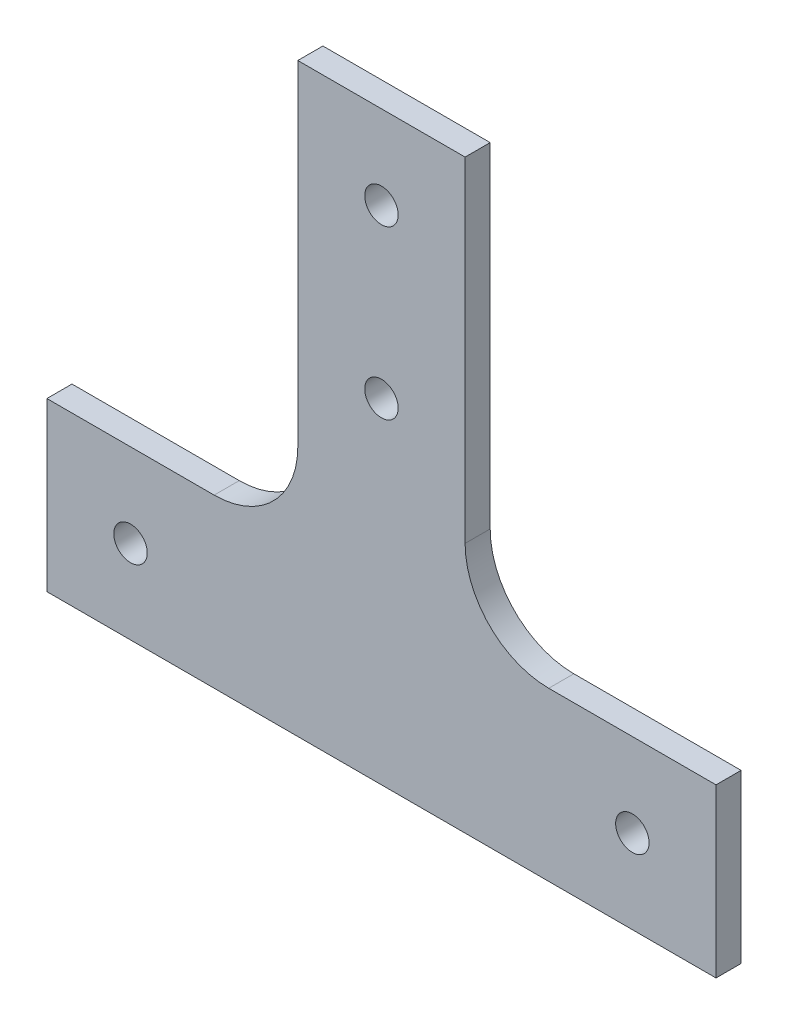
ISO-10303-21;
HEADER;
FILE_DESCRIPTION(('STEP AP214'),'2;1');
FILE_NAME('part.step','',(''),(''),'','','');
FILE_SCHEMA(('AUTOMOTIVE_DESIGN { 1 0 10303 214 1 1 1 1 }'));
ENDSEC;
DATA;
#1=APPLICATION_CONTEXT('core data for automotive mechanical design processes');
#2=APPLICATION_PROTOCOL_DEFINITION('international standard','automotive_design',2000,#1);
#3=PRODUCT_CONTEXT('',#1,'mechanical');
#4=PRODUCT('Part','Part','',(#3));
#5=PRODUCT_RELATED_PRODUCT_CATEGORY('part','',(#4));
#6=PRODUCT_DEFINITION_FORMATION('','',#4);
#7=PRODUCT_DEFINITION_CONTEXT('part definition',#1,'design');
#8=PRODUCT_DEFINITION('design','',#6,#7);
#9=PRODUCT_DEFINITION_SHAPE('','',#8);
#10=(LENGTH_UNIT() NAMED_UNIT(*) SI_UNIT(.MILLI.,.METRE.));
#11=(NAMED_UNIT(*) PLANE_ANGLE_UNIT() SI_UNIT($,.RADIAN.));
#12=(NAMED_UNIT(*) SI_UNIT($,.STERADIAN.) SOLID_ANGLE_UNIT());
#13=UNCERTAINTY_MEASURE_WITH_UNIT(LENGTH_MEASURE(1.E-05),#10,'distance_accuracy_value','');
#14=(GEOMETRIC_REPRESENTATION_CONTEXT(3) GLOBAL_UNCERTAINTY_ASSIGNED_CONTEXT((#13)) GLOBAL_UNIT_ASSIGNED_CONTEXT((#10,
#11,#12)) REPRESENTATION_CONTEXT('',''));
#15=CARTESIAN_POINT('',(0.,0.,0.));
#16=DIRECTION('',(0.,0.,1.));
#17=DIRECTION('',(1.,0.,0.));
#18=AXIS2_PLACEMENT_3D('',#15,#16,#17);
#19=CARTESIAN_POINT('',(-10.,0.,3.));
#20=DIRECTION('',(-1.,0.,0.));
#21=DIRECTION('',(0.,0.,1.));
#22=AXIS2_PLACEMENT_3D('',#19,#20,#21);
#23=PLANE('',#22);
#24=DIRECTION('',(0.,1.,0.));
#25=VECTOR('',#24,1.);
#26=CARTESIAN_POINT('',(-10.,0.,0.));
#27=LINE('',#26,#25);
#28=CARTESIAN_POINT('',(-10.,20.,0.));
#29=VERTEX_POINT('',#28);
#30=CARTESIAN_POINT('',(-10.,60.,0.));
#31=VERTEX_POINT('',#30);
#32=EDGE_CURVE('E196',#29,#31,#27,.T.);
#33=ORIENTED_EDGE('',*,*,#32,.F.);
#34=DIRECTION('',(0.,0.,-1.));
#35=VECTOR('',#34,1.);
#36=CARTESIAN_POINT('',(-10.,20.,3.));
#37=LINE('',#36,#35);
#38=CARTESIAN_POINT('',(-10.,20.,3.));
#39=VERTEX_POINT('',#38);
#40=EDGE_CURVE('E246',#29,#39,#37,.F.);
#41=ORIENTED_EDGE('',*,*,#40,.T.);
#42=DIRECTION('',(0.,1.,0.));
#43=VECTOR('',#42,1.);
#44=CARTESIAN_POINT('',(-10.,0.,3.));
#45=LINE('',#44,#43);
#46=CARTESIAN_POINT('',(-10.,60.,3.));
#47=VERTEX_POINT('',#46);
#48=EDGE_CURVE('E154',#39,#47,#45,.T.);
#49=ORIENTED_EDGE('',*,*,#48,.T.);
#50=DIRECTION('',(0.,0.,-1.));
#51=VECTOR('',#50,1.);
#52=CARTESIAN_POINT('',(-10.,60.,3.));
#53=LINE('',#52,#51);
#54=EDGE_CURVE('E187',#47,#31,#53,.T.);
#55=ORIENTED_EDGE('',*,*,#54,.T.);
#56=EDGE_LOOP('',(#33,#41,#49,#55));
#57=FACE_BOUND('',#56,.T.);
#58=ADVANCED_FACE('F47',(#57),#23,.T.);
#59=CARTESIAN_POINT('',(0.,10.,3.));
#60=DIRECTION('',(0.,1.,0.));
#61=DIRECTION('',(-1.,0.,0.));
#62=AXIS2_PLACEMENT_3D('',#59,#60,#61);
#63=PLANE('',#62);
#64=DIRECTION('',(1.,0.,0.));
#65=VECTOR('',#64,1.);
#66=CARTESIAN_POINT('',(0.,10.,3.));
#67=LINE('',#66,#65);
#68=CARTESIAN_POINT('',(-40.,9.99999999999999,3.));
#69=VERTEX_POINT('',#68);
#70=CARTESIAN_POINT('',(-20.,10.,3.));
#71=VERTEX_POINT('',#70);
#72=EDGE_CURVE('E128',#69,#71,#67,.T.);
#73=ORIENTED_EDGE('',*,*,#72,.T.);
#74=DIRECTION('',(0.,0.,-1.));
#75=VECTOR('',#74,1.);
#76=CARTESIAN_POINT('',(-20.,10.,0.));
#77=LINE('',#76,#75);
#78=CARTESIAN_POINT('',(-20.,10.,0.));
#79=VERTEX_POINT('',#78);
#80=EDGE_CURVE('E136',#71,#79,#77,.T.);
#81=ORIENTED_EDGE('',*,*,#80,.T.);
#82=DIRECTION('',(1.,0.,0.));
#83=VECTOR('',#82,1.);
#84=CARTESIAN_POINT('',(0.,10.,0.));
#85=LINE('',#84,#83);
#86=CARTESIAN_POINT('',(-40.,9.99999999999999,0.));
#87=VERTEX_POINT('',#86);
#88=EDGE_CURVE('E131',#87,#79,#85,.T.);
#89=ORIENTED_EDGE('',*,*,#88,.F.);
#90=DIRECTION('',(0.,0.,-1.));
#91=VECTOR('',#90,1.);
#92=CARTESIAN_POINT('',(-40.,9.99999999999999,3.));
#93=LINE('',#92,#91);
#94=EDGE_CURVE('E123',#69,#87,#93,.T.);
#95=ORIENTED_EDGE('',*,*,#94,.F.);
#96=EDGE_LOOP('',(#73,#81,#89,#95));
#97=FACE_BOUND('',#96,.T.);
#98=ADVANCED_FACE('F125',(#97),#63,.T.);
#99=CARTESIAN_POINT('',(-40.,0.,3.));
#100=DIRECTION('',(1.,0.,0.));
#101=DIRECTION('',(0.,1.,0.));
#102=AXIS2_PLACEMENT_3D('',#99,#100,#101);
#103=PLANE('',#102);
#104=DIRECTION('',(0.,-1.,0.));
#105=VECTOR('',#104,1.);
#106=CARTESIAN_POINT('',(-40.,0.,0.));
#107=LINE('',#106,#105);
#108=CARTESIAN_POINT('',(-40.,-10.,0.));
#109=VERTEX_POINT('',#108);
#110=EDGE_CURVE('E201',#87,#109,#107,.T.);
#111=ORIENTED_EDGE('',*,*,#110,.T.);
#112=DIRECTION('',(0.,0.,-1.));
#113=VECTOR('',#112,1.);
#114=CARTESIAN_POINT('',(-40.,-10.,3.));
#115=LINE('',#114,#113);
#116=CARTESIAN_POINT('',(-40.,-10.,3.));
#117=VERTEX_POINT('',#116);
#118=EDGE_CURVE('E137',#117,#109,#115,.T.);
#119=ORIENTED_EDGE('',*,*,#118,.F.);
#120=DIRECTION('',(0.,-1.,0.));
#121=VECTOR('',#120,1.);
#122=CARTESIAN_POINT('',(-40.,0.,3.));
#123=LINE('',#122,#121);
#124=EDGE_CURVE('E141',#69,#117,#123,.T.);
#125=ORIENTED_EDGE('',*,*,#124,.F.);
#126=ORIENTED_EDGE('',*,*,#94,.T.);
#127=EDGE_LOOP('',(#111,#119,#125,#126));
#128=FACE_BOUND('',#127,.T.);
#129=ADVANCED_FACE('F142',(#128),#103,.F.);
#130=CARTESIAN_POINT('',(0.,-10.,3.));
#131=DIRECTION('',(0.,1.,0.));
#132=DIRECTION('',(-1.,0.,0.));
#133=AXIS2_PLACEMENT_3D('',#130,#131,#132);
#134=PLANE('',#133);
#135=DIRECTION('',(1.,0.,0.));
#136=VECTOR('',#135,1.);
#137=CARTESIAN_POINT('',(0.,-10.,0.));
#138=LINE('',#137,#136);
#139=CARTESIAN_POINT('',(40.,-10.,0.));
#140=VERTEX_POINT('',#139);
#141=EDGE_CURVE('E205',#109,#140,#138,.T.);
#142=ORIENTED_EDGE('',*,*,#141,.T.);
#143=DIRECTION('',(0.,0.,-1.));
#144=VECTOR('',#143,1.);
#145=CARTESIAN_POINT('',(40.,-10.,3.));
#146=LINE('',#145,#144);
#147=CARTESIAN_POINT('',(40.,-10.,3.));
#148=VERTEX_POINT('',#147);
#149=EDGE_CURVE('E239',#148,#140,#146,.T.);
#150=ORIENTED_EDGE('',*,*,#149,.F.);
#151=DIRECTION('',(1.,0.,0.));
#152=VECTOR('',#151,1.);
#153=CARTESIAN_POINT('',(0.,-10.,3.));
#154=LINE('',#153,#152);
#155=EDGE_CURVE('E146',#117,#148,#154,.T.);
#156=ORIENTED_EDGE('',*,*,#155,.F.);
#157=ORIENTED_EDGE('',*,*,#118,.T.);
#158=EDGE_LOOP('',(#142,#150,#156,#157));
#159=FACE_BOUND('',#158,.T.);
#160=ADVANCED_FACE('F335',(#159),#134,.F.);
#161=CARTESIAN_POINT('',(40.,0.,3.));
#162=DIRECTION('',(1.,0.,0.));
#163=DIRECTION('',(0.,1.,0.));
#164=AXIS2_PLACEMENT_3D('',#161,#162,#163);
#165=PLANE('',#164);
#166=DIRECTION('',(0.,-1.,0.));
#167=VECTOR('',#166,1.);
#168=CARTESIAN_POINT('',(40.,0.,0.));
#169=LINE('',#168,#167);
#170=CARTESIAN_POINT('',(40.,10.,0.));
#171=VERTEX_POINT('',#170);
#172=EDGE_CURVE('E209',#171,#140,#169,.T.);
#173=ORIENTED_EDGE('',*,*,#172,.F.);
#174=DIRECTION('',(0.,0.,-1.));
#175=VECTOR('',#174,1.);
#176=CARTESIAN_POINT('',(40.,10.,3.));
#177=LINE('',#176,#175);
#178=CARTESIAN_POINT('',(40.,10.,3.));
#179=VERTEX_POINT('',#178);
#180=EDGE_CURVE('E236',#179,#171,#177,.T.);
#181=ORIENTED_EDGE('',*,*,#180,.F.);
#182=DIRECTION('',(0.,-1.,0.));
#183=VECTOR('',#182,1.);
#184=CARTESIAN_POINT('',(40.,0.,3.));
#185=LINE('',#184,#183);
#186=EDGE_CURVE('E162',#179,#148,#185,.T.);
#187=ORIENTED_EDGE('',*,*,#186,.T.);
#188=ORIENTED_EDGE('',*,*,#149,.T.);
#189=EDGE_LOOP('',(#173,#181,#187,#188));
#190=FACE_BOUND('',#189,.T.);
#191=ADVANCED_FACE('F333',(#190),#165,.T.);
#192=CARTESIAN_POINT('',(20.,10.,0.));
#193=VERTEX_POINT('',#192);
#194=EDGE_CURVE('E202',#193,#171,#85,.T.);
#195=ORIENTED_EDGE('',*,*,#194,.F.);
#196=DIRECTION('',(0.,0.,-1.));
#197=VECTOR('',#196,1.);
#198=CARTESIAN_POINT('',(20.,10.,3.));
#199=LINE('',#198,#197);
#200=CARTESIAN_POINT('',(20.,10.,3.));
#201=VERTEX_POINT('',#200);
#202=EDGE_CURVE('E63',#193,#201,#199,.F.);
#203=ORIENTED_EDGE('',*,*,#202,.T.);
#204=EDGE_CURVE('E156',#201,#179,#67,.T.);
#205=ORIENTED_EDGE('',*,*,#204,.T.);
#206=ORIENTED_EDGE('',*,*,#180,.T.);
#207=EDGE_LOOP('',(#195,#203,#205,#206));
#208=FACE_BOUND('',#207,.T.);
#209=ADVANCED_FACE('F285',(#208),#63,.T.);
#210=CARTESIAN_POINT('',(10.,0.,3.));
#211=DIRECTION('',(-1.,0.,0.));
#212=DIRECTION('',(0.,0.,1.));
#213=AXIS2_PLACEMENT_3D('',#210,#211,#212);
#214=PLANE('',#213);
#215=DIRECTION('',(0.,1.,0.));
#216=VECTOR('',#215,1.);
#217=CARTESIAN_POINT('',(10.,0.,3.));
#218=LINE('',#217,#216);
#219=CARTESIAN_POINT('',(10.,20.,3.));
#220=VERTEX_POINT('',#219);
#221=CARTESIAN_POINT('',(10.,60.,3.));
#222=VERTEX_POINT('',#221);
#223=EDGE_CURVE('E161',#220,#222,#218,.T.);
#224=ORIENTED_EDGE('',*,*,#223,.F.);
#225=DIRECTION('',(0.,0.,-1.));
#226=VECTOR('',#225,1.);
#227=CARTESIAN_POINT('',(10.,20.,3.));
#228=LINE('',#227,#226);
#229=CARTESIAN_POINT('',(10.,20.,0.));
#230=VERTEX_POINT('',#229);
#231=EDGE_CURVE('E249',#220,#230,#228,.T.);
#232=ORIENTED_EDGE('',*,*,#231,.T.);
#233=DIRECTION('',(0.,1.,0.));
#234=VECTOR('',#233,1.);
#235=CARTESIAN_POINT('',(10.,0.,0.));
#236=LINE('',#235,#234);
#237=CARTESIAN_POINT('',(10.,60.,0.));
#238=VERTEX_POINT('',#237);
#239=EDGE_CURVE('E213',#230,#238,#236,.T.);
#240=ORIENTED_EDGE('',*,*,#239,.T.);
#241=DIRECTION('',(0.,0.,-1.));
#242=VECTOR('',#241,1.);
#243=CARTESIAN_POINT('',(10.,60.,3.));
#244=LINE('',#243,#242);
#245=EDGE_CURVE('E232',#222,#238,#244,.T.);
#246=ORIENTED_EDGE('',*,*,#245,.F.);
#247=EDGE_LOOP('',(#224,#232,#240,#246));
#248=FACE_BOUND('',#247,.T.);
#249=ADVANCED_FACE('F325',(#248),#214,.F.);
#250=CARTESIAN_POINT('',(30.,0.,3.));
#251=DIRECTION('',(0.,0.,-1.));
#252=DIRECTION('',(-1.,0.,0.));
#253=AXIS2_PLACEMENT_3D('',#250,#251,#252);
#254=CYLINDRICAL_SURFACE('',#253,2.);
#255=CARTESIAN_POINT('',(30.,0.,3.));
#256=DIRECTION('',(0.,0.,1.));
#257=DIRECTION('',(1.,0.,0.));
#258=AXIS2_PLACEMENT_3D('',#255,#256,#257);
#259=CIRCLE('',#258,2.);
#260=CARTESIAN_POINT('',(32.,0.,3.));
#261=VERTEX_POINT('',#260);
#262=EDGE_CURVE('E179',#261,#261,#259,.T.);
#263=ORIENTED_EDGE('',*,*,#262,.T.);
#264=EDGE_LOOP('',(#263));
#265=FACE_BOUND('',#264,.T.);
#266=CARTESIAN_POINT('',(30.,0.,0.));
#267=DIRECTION('',(0.,0.,1.));
#268=DIRECTION('',(1.,0.,0.));
#269=AXIS2_PLACEMENT_3D('',#266,#267,#268);
#270=CIRCLE('',#269,2.);
#271=CARTESIAN_POINT('',(32.,0.,0.));
#272=VERTEX_POINT('',#271);
#273=EDGE_CURVE('E220',#272,#272,#270,.T.);
#274=ORIENTED_EDGE('',*,*,#273,.F.);
#275=EDGE_LOOP('',(#274));
#276=FACE_BOUND('',#275,.T.);
#277=ADVANCED_FACE('F322',(#265,#276),#254,.F.);
#278=CARTESIAN_POINT('',(0.,60.,3.));
#279=DIRECTION('',(0.,1.,0.));
#280=DIRECTION('',(0.,0.,1.));
#281=AXIS2_PLACEMENT_3D('',#278,#279,#280);
#282=PLANE('',#281);
#283=DIRECTION('',(1.,0.,0.));
#284=VECTOR('',#283,1.);
#285=CARTESIAN_POINT('',(0.,60.,0.));
#286=LINE('',#285,#284);
#287=EDGE_CURVE('E216',#31,#238,#286,.T.);
#288=ORIENTED_EDGE('',*,*,#287,.F.);
#289=ORIENTED_EDGE('',*,*,#54,.F.);
#290=DIRECTION('',(1.,0.,0.));
#291=VECTOR('',#290,1.);
#292=CARTESIAN_POINT('',(0.,60.,3.));
#293=LINE('',#292,#291);
#294=EDGE_CURVE('E167',#47,#222,#293,.T.);
#295=ORIENTED_EDGE('',*,*,#294,.T.);
#296=ORIENTED_EDGE('',*,*,#245,.T.);
#297=EDGE_LOOP('',(#288,#289,#295,#296));
#298=FACE_BOUND('',#297,.T.);
#299=ADVANCED_FACE('F292',(#298),#282,.T.);
#300=CARTESIAN_POINT('',(0.,30.,3.));
#301=DIRECTION('',(0.,0.,-1.));
#302=DIRECTION('',(-1.,0.,0.));
#303=AXIS2_PLACEMENT_3D('',#300,#301,#302);
#304=CYLINDRICAL_SURFACE('',#303,2.);
#305=CARTESIAN_POINT('',(0.,30.,3.));
#306=DIRECTION('',(0.,0.,1.));
#307=DIRECTION('',(1.,0.,0.));
#308=AXIS2_PLACEMENT_3D('',#305,#306,#307);
#309=CIRCLE('',#308,2.);
#310=CARTESIAN_POINT('',(2.,30.,3.));
#311=VERTEX_POINT('',#310);
#312=EDGE_CURVE('E158',#311,#311,#309,.T.);
#313=ORIENTED_EDGE('',*,*,#312,.T.);
#314=EDGE_LOOP('',(#313));
#315=FACE_BOUND('',#314,.T.);
#316=CARTESIAN_POINT('',(0.,30.,0.));
#317=DIRECTION('',(0.,0.,1.));
#318=DIRECTION('',(1.,0.,0.));
#319=AXIS2_PLACEMENT_3D('',#316,#317,#318);
#320=CIRCLE('',#319,2.);
#321=CARTESIAN_POINT('',(2.,30.,0.));
#322=VERTEX_POINT('',#321);
#323=EDGE_CURVE('E192',#322,#322,#320,.T.);
#324=ORIENTED_EDGE('',*,*,#323,.F.);
#325=EDGE_LOOP('',(#324));
#326=FACE_BOUND('',#325,.T.);
#327=ADVANCED_FACE('F289',(#315,#326),#304,.F.);
#328=CARTESIAN_POINT('',(0.,50.,3.));
#329=DIRECTION('',(0.,0.,-1.));
#330=DIRECTION('',(-1.,0.,0.));
#331=AXIS2_PLACEMENT_3D('',#328,#329,#330);
#332=CYLINDRICAL_SURFACE('',#331,2.);
#333=CARTESIAN_POINT('',(0.,50.,3.));
#334=DIRECTION('',(0.,0.,1.));
#335=DIRECTION('',(1.,0.,0.));
#336=AXIS2_PLACEMENT_3D('',#333,#334,#335);
#337=CIRCLE('',#336,2.);
#338=CARTESIAN_POINT('',(2.,50.,3.));
#339=VERTEX_POINT('',#338);
#340=EDGE_CURVE('E228',#339,#339,#337,.T.);
#341=ORIENTED_EDGE('',*,*,#340,.T.);
#342=EDGE_LOOP('',(#341));
#343=FACE_BOUND('',#342,.T.);
#344=CARTESIAN_POINT('',(0.,50.,0.));
#345=DIRECTION('',(0.,0.,1.));
#346=DIRECTION('',(1.,0.,0.));
#347=AXIS2_PLACEMENT_3D('',#344,#345,#346);
#348=CIRCLE('',#347,2.);
#349=CARTESIAN_POINT('',(2.,50.,0.));
#350=VERTEX_POINT('',#349);
#351=EDGE_CURVE('E188',#350,#350,#348,.T.);
#352=ORIENTED_EDGE('',*,*,#351,.F.);
#353=EDGE_LOOP('',(#352));
#354=FACE_BOUND('',#353,.T.);
#355=ADVANCED_FACE('F291',(#343,#354),#332,.F.);
#356=CARTESIAN_POINT('',(-30.,0.,3.));
#357=DIRECTION('',(0.,0.,-1.));
#358=DIRECTION('',(-1.,0.,0.));
#359=AXIS2_PLACEMENT_3D('',#356,#357,#358);
#360=CYLINDRICAL_SURFACE('',#359,2.);
#361=CARTESIAN_POINT('',(-30.,0.,3.));
#362=DIRECTION('',(0.,0.,1.));
#363=DIRECTION('',(1.,0.,0.));
#364=AXIS2_PLACEMENT_3D('',#361,#362,#363);
#365=CIRCLE('',#364,2.);
#366=CARTESIAN_POINT('',(-28.,0.,3.));
#367=VERTEX_POINT('',#366);
#368=EDGE_CURVE('E183',#367,#367,#365,.T.);
#369=ORIENTED_EDGE('',*,*,#368,.T.);
#370=EDGE_LOOP('',(#369));
#371=FACE_BOUND('',#370,.T.);
#372=CARTESIAN_POINT('',(-30.,0.,0.));
#373=DIRECTION('',(0.,0.,1.));
#374=DIRECTION('',(1.,0.,0.));
#375=AXIS2_PLACEMENT_3D('',#372,#373,#374);
#376=CIRCLE('',#375,2.);
#377=CARTESIAN_POINT('',(-28.,0.,0.));
#378=VERTEX_POINT('',#377);
#379=EDGE_CURVE('E224',#378,#378,#376,.T.);
#380=ORIENTED_EDGE('',*,*,#379,.F.);
#381=EDGE_LOOP('',(#380));
#382=FACE_BOUND('',#381,.T.);
#383=ADVANCED_FACE('F295',(#371,#382),#360,.F.);
#384=CARTESIAN_POINT('',(0.,0.,3.));
#385=DIRECTION('',(0.,0.,1.));
#386=DIRECTION('',(1.,0.,0.));
#387=AXIS2_PLACEMENT_3D('',#384,#385,#386);
#388=PLANE('',#387);
#389=ORIENTED_EDGE('',*,*,#340,.F.);
#390=EDGE_LOOP('',(#389));
#391=FACE_BOUND('',#390,.T.);
#392=ORIENTED_EDGE('',*,*,#312,.F.);
#393=EDGE_LOOP('',(#392));
#394=FACE_BOUND('',#393,.T.);
#395=ORIENTED_EDGE('',*,*,#48,.F.);
#396=CARTESIAN_POINT('',(-20.,20.,3.));
#397=DIRECTION('',(0.,0.,1.));
#398=DIRECTION('',(1.,0.,0.));
#399=AXIS2_PLACEMENT_3D('',#396,#397,#398);
#400=CIRCLE('',#399,10.);
#401=EDGE_CURVE('E152',#39,#71,#400,.F.);
#402=ORIENTED_EDGE('',*,*,#401,.T.);
#403=ORIENTED_EDGE('',*,*,#72,.F.);
#404=ORIENTED_EDGE('',*,*,#124,.T.);
#405=ORIENTED_EDGE('',*,*,#155,.T.);
#406=ORIENTED_EDGE('',*,*,#186,.F.);
#407=ORIENTED_EDGE('',*,*,#204,.F.);
#408=CARTESIAN_POINT('',(20.,20.,3.));
#409=DIRECTION('',(0.,0.,1.));
#410=DIRECTION('',(1.,0.,0.));
#411=AXIS2_PLACEMENT_3D('',#408,#409,#410);
#412=CIRCLE('',#411,10.);
#413=EDGE_CURVE('E11',#201,#220,#412,.F.);
#414=ORIENTED_EDGE('',*,*,#413,.T.);
#415=ORIENTED_EDGE('',*,*,#223,.T.);
#416=ORIENTED_EDGE('',*,*,#294,.F.);
#417=EDGE_LOOP('',(#395,#402,#403,#404,#405,#406,#407,#414,#415,#416));
#418=FACE_BOUND('',#417,.T.);
#419=ORIENTED_EDGE('',*,*,#262,.F.);
#420=EDGE_LOOP('',(#419));
#421=FACE_BOUND('',#420,.T.);
#422=ORIENTED_EDGE('',*,*,#368,.F.);
#423=EDGE_LOOP('',(#422));
#424=FACE_BOUND('',#423,.T.);
#425=ADVANCED_FACE('F149',(#391,#394,#418,#421,#424),#388,.T.);
#426=CARTESIAN_POINT('',(0.,0.,0.));
#427=DIRECTION('',(0.,0.,1.));
#428=DIRECTION('',(1.,0.,0.));
#429=AXIS2_PLACEMENT_3D('',#426,#427,#428);
#430=PLANE('',#429);
#431=ORIENTED_EDGE('',*,*,#351,.T.);
#432=EDGE_LOOP('',(#431));
#433=FACE_BOUND('',#432,.T.);
#434=ORIENTED_EDGE('',*,*,#323,.T.);
#435=EDGE_LOOP('',(#434));
#436=FACE_BOUND('',#435,.T.);
#437=ORIENTED_EDGE('',*,*,#88,.T.);
#438=CARTESIAN_POINT('',(-20.,20.,0.));
#439=DIRECTION('',(0.,0.,1.));
#440=DIRECTION('',(1.,0.,0.));
#441=AXIS2_PLACEMENT_3D('',#438,#439,#440);
#442=CIRCLE('',#441,10.);
#443=EDGE_CURVE('E255',#79,#29,#442,.T.);
#444=ORIENTED_EDGE('',*,*,#443,.T.);
#445=ORIENTED_EDGE('',*,*,#32,.T.);
#446=ORIENTED_EDGE('',*,*,#287,.T.);
#447=ORIENTED_EDGE('',*,*,#239,.F.);
#448=CARTESIAN_POINT('',(20.,20.,0.));
#449=DIRECTION('',(0.,0.,1.));
#450=DIRECTION('',(1.,0.,0.));
#451=AXIS2_PLACEMENT_3D('',#448,#449,#450);
#452=CIRCLE('',#451,10.);
#453=EDGE_CURVE('E56',#230,#193,#452,.T.);
#454=ORIENTED_EDGE('',*,*,#453,.T.);
#455=ORIENTED_EDGE('',*,*,#194,.T.);
#456=ORIENTED_EDGE('',*,*,#172,.T.);
#457=ORIENTED_EDGE('',*,*,#141,.F.);
#458=ORIENTED_EDGE('',*,*,#110,.F.);
#459=EDGE_LOOP('',(#437,#444,#445,#446,#447,#454,#455,#456,#457,#458));
#460=FACE_BOUND('',#459,.T.);
#461=ORIENTED_EDGE('',*,*,#273,.T.);
#462=EDGE_LOOP('',(#461));
#463=FACE_BOUND('',#462,.T.);
#464=ORIENTED_EDGE('',*,*,#379,.T.);
#465=EDGE_LOOP('',(#464));
#466=FACE_BOUND('',#465,.T.);
#467=ADVANCED_FACE('F261',(#433,#436,#460,#463,#466),#430,.F.);
#468=CARTESIAN_POINT('',(-20.,20.,3.));
#469=DIRECTION('',(0.,0.,1.));
#470=DIRECTION('',(1.,0.,0.));
#471=AXIS2_PLACEMENT_3D('',#468,#469,#470);
#472=CYLINDRICAL_SURFACE('',#471,10.);
#473=ORIENTED_EDGE('',*,*,#401,.F.);
#474=ORIENTED_EDGE('',*,*,#40,.F.);
#475=ORIENTED_EDGE('',*,*,#443,.F.);
#476=ORIENTED_EDGE('',*,*,#80,.F.);
#477=EDGE_LOOP('',(#473,#474,#475,#476));
#478=FACE_BOUND('',#477,.T.);
#479=ADVANCED_FACE('F268',(#478),#472,.F.);
#480=CARTESIAN_POINT('',(20.,20.,3.));
#481=DIRECTION('',(0.,0.,-1.));
#482=DIRECTION('',(-1.,0.,0.));
#483=AXIS2_PLACEMENT_3D('',#480,#481,#482);
#484=CYLINDRICAL_SURFACE('',#483,10.);
#485=ORIENTED_EDGE('',*,*,#413,.F.);
#486=ORIENTED_EDGE('',*,*,#202,.F.);
#487=ORIENTED_EDGE('',*,*,#453,.F.);
#488=ORIENTED_EDGE('',*,*,#231,.F.);
#489=EDGE_LOOP('',(#485,#486,#487,#488));
#490=FACE_BOUND('',#489,.T.);
#491=ADVANCED_FACE('F49',(#490),#484,.F.);
#492=CLOSED_SHELL('',(#58,#98,#129,#160,#191,#209,#249,#277,#299,#327,#355,#383,#425,#467,#479,#491));
#493=MANIFOLD_SOLID_BREP('B2',#492);
#494=ADVANCED_BREP_SHAPE_REPRESENTATION('',(#18,#493),#14);
#495=SHAPE_DEFINITION_REPRESENTATION(#9,#494);
ENDSEC;
END-ISO-10303-21;
